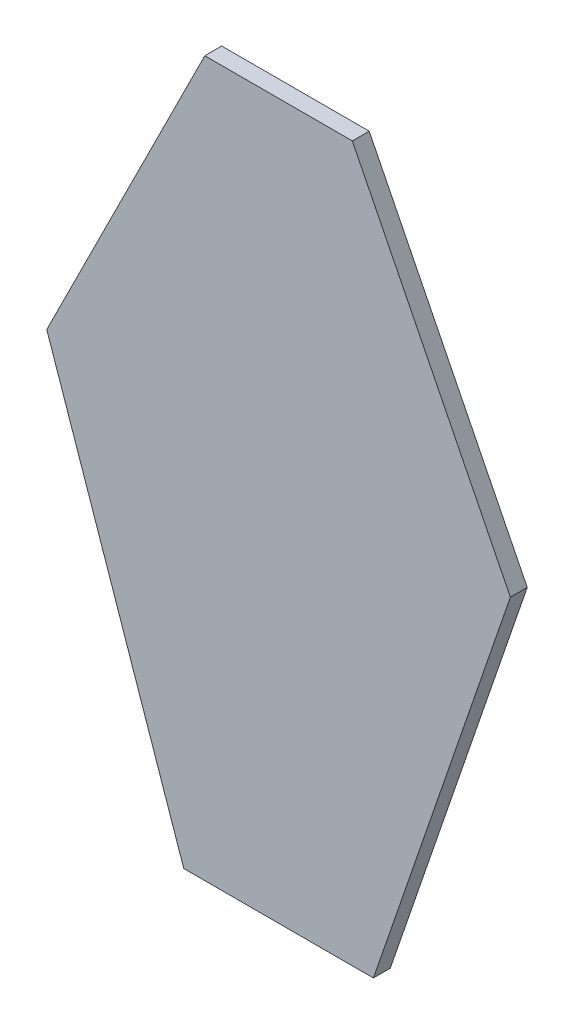
ISO-10303-21;
HEADER;
FILE_DESCRIPTION(('STEP AP214'),'2;1');
FILE_NAME('part.step','',(''),(''),'','','');
FILE_SCHEMA(('AUTOMOTIVE_DESIGN { 1 0 10303 214 1 1 1 1 }'));
ENDSEC;
DATA;
#1=APPLICATION_CONTEXT('core data for automotive mechanical design processes');
#2=APPLICATION_PROTOCOL_DEFINITION('international standard','automotive_design',2000,#1);
#3=PRODUCT_CONTEXT('',#1,'mechanical');
#4=PRODUCT('Part','Part','',(#3));
#5=PRODUCT_RELATED_PRODUCT_CATEGORY('part','',(#4));
#6=PRODUCT_DEFINITION_FORMATION('','',#4);
#7=PRODUCT_DEFINITION_CONTEXT('part definition',#1,'design');
#8=PRODUCT_DEFINITION('design','',#6,#7);
#9=PRODUCT_DEFINITION_SHAPE('','',#8);
#10=(LENGTH_UNIT() NAMED_UNIT(*) SI_UNIT(.MILLI.,.METRE.));
#11=(NAMED_UNIT(*) PLANE_ANGLE_UNIT() SI_UNIT($,.RADIAN.));
#12=(NAMED_UNIT(*) SI_UNIT($,.STERADIAN.) SOLID_ANGLE_UNIT());
#13=UNCERTAINTY_MEASURE_WITH_UNIT(LENGTH_MEASURE(1.E-05),#10,'distance_accuracy_value','');
#14=(GEOMETRIC_REPRESENTATION_CONTEXT(3) GLOBAL_UNCERTAINTY_ASSIGNED_CONTEXT((#13)) GLOBAL_UNIT_ASSIGNED_CONTEXT((#10,
#11,#12)) REPRESENTATION_CONTEXT('',''));
#15=CARTESIAN_POINT('',(0.,0.,0.));
#16=DIRECTION('',(0.,0.,1.));
#17=DIRECTION('',(1.,0.,0.));
#18=AXIS2_PLACEMENT_3D('',#15,#16,#17);
#19=CARTESIAN_POINT('',(-409.,-450.,16.));
#20=DIRECTION('',(0.,0.,1.));
#21=DIRECTION('',(1.,0.,0.));
#22=AXIS2_PLACEMENT_3D('',#19,#20,#21);
#23=PLANE('',#22);
#24=DIRECTION('',(-0.447213595499958,-0.894427190999916,0.));
#25=VECTOR('',#24,1.);
#26=CARTESIAN_POINT('',(-70.,228.,16.));
#27=LINE('',#26,#25);
#28=CARTESIAN_POINT('',(-70.,228.,16.));
#29=VERTEX_POINT('',#28);
#30=CARTESIAN_POINT('',(-220.,-71.9999999999998,16.));
#31=VERTEX_POINT('',#30);
#32=EDGE_CURVE('E126',#29,#31,#27,.T.);
#33=ORIENTED_EDGE('',*,*,#32,.T.);
#34=DIRECTION('',(0.325219597367365,-0.945638521575876,0.));
#35=VECTOR('',#34,1.);
#36=CARTESIAN_POINT('',(-220.,-71.9999999999998,16.));
#37=LINE('',#36,#35);
#38=CARTESIAN_POINT('',(-89.9999999999999,-450.,16.));
#39=VERTEX_POINT('',#38);
#40=EDGE_CURVE('E86',#31,#39,#37,.T.);
#41=ORIENTED_EDGE('',*,*,#40,.T.);
#42=DIRECTION('',(1.,0.,0.));
#43=VECTOR('',#42,1.);
#44=CARTESIAN_POINT('',(-89.9999999999999,-450.,16.));
#45=LINE('',#44,#43);
#46=CARTESIAN_POINT('',(90.0000000000001,-450.,16.));
#47=VERTEX_POINT('',#46);
#48=EDGE_CURVE('E98',#39,#47,#45,.T.);
#49=ORIENTED_EDGE('',*,*,#48,.T.);
#50=DIRECTION('',(0.325219597367365,0.945638521575876,0.));
#51=VECTOR('',#50,1.);
#52=CARTESIAN_POINT('',(220.,-71.9999999999996,16.));
#53=LINE('',#52,#51);
#54=CARTESIAN_POINT('',(220.,-71.9999999999996,16.));
#55=VERTEX_POINT('',#54);
#56=EDGE_CURVE('E93',#47,#55,#53,.T.);
#57=ORIENTED_EDGE('',*,*,#56,.T.);
#58=DIRECTION('',(-0.447213595499958,0.894427190999916,0.));
#59=VECTOR('',#58,1.);
#60=CARTESIAN_POINT('',(70.,228.,16.));
#61=LINE('',#60,#59);
#62=CARTESIAN_POINT('',(70.,228.,16.));
#63=VERTEX_POINT('',#62);
#64=EDGE_CURVE('E96',#55,#63,#61,.T.);
#65=ORIENTED_EDGE('',*,*,#64,.T.);
#66=DIRECTION('',(-1.,0.,0.));
#67=VECTOR('',#66,1.);
#68=CARTESIAN_POINT('',(-70.,228.,16.));
#69=LINE('',#68,#67);
#70=EDGE_CURVE('E49',#63,#29,#69,.T.);
#71=ORIENTED_EDGE('',*,*,#70,.T.);
#72=EDGE_LOOP('',(#33,#41,#49,#57,#65,#71));
#73=FACE_BOUND('',#72,.T.);
#74=ADVANCED_FACE('F32',(#73),#23,.T.);
#75=CARTESIAN_POINT('',(-409.,-450.,0.));
#76=DIRECTION('',(0.,0.,1.));
#77=DIRECTION('',(1.,0.,0.));
#78=AXIS2_PLACEMENT_3D('',#75,#76,#77);
#79=PLANE('',#78);
#80=DIRECTION('',(-0.447213595499958,-0.894427190999916,0.));
#81=VECTOR('',#80,1.);
#82=CARTESIAN_POINT('',(-70.,228.,0.));
#83=LINE('',#82,#81);
#84=CARTESIAN_POINT('',(-70.,228.,0.));
#85=VERTEX_POINT('',#84);
#86=CARTESIAN_POINT('',(-220.,-71.9999999999998,0.));
#87=VERTEX_POINT('',#86);
#88=EDGE_CURVE('E116',#85,#87,#83,.T.);
#89=ORIENTED_EDGE('',*,*,#88,.F.);
#90=DIRECTION('',(-1.,0.,0.));
#91=VECTOR('',#90,1.);
#92=CARTESIAN_POINT('',(-70.,228.,0.));
#93=LINE('',#92,#91);
#94=CARTESIAN_POINT('',(70.,228.,0.));
#95=VERTEX_POINT('',#94);
#96=EDGE_CURVE('E78',#95,#85,#93,.T.);
#97=ORIENTED_EDGE('',*,*,#96,.F.);
#98=DIRECTION('',(-0.447213595499958,0.894427190999916,0.));
#99=VECTOR('',#98,1.);
#100=CARTESIAN_POINT('',(70.,228.,0.));
#101=LINE('',#100,#99);
#102=CARTESIAN_POINT('',(220.,-71.9999999999996,0.));
#103=VERTEX_POINT('',#102);
#104=EDGE_CURVE('E72',#103,#95,#101,.T.);
#105=ORIENTED_EDGE('',*,*,#104,.F.);
#106=DIRECTION('',(0.325219597367365,0.945638521575876,0.));
#107=VECTOR('',#106,1.);
#108=CARTESIAN_POINT('',(220.,-71.9999999999996,0.));
#109=LINE('',#108,#107);
#110=CARTESIAN_POINT('',(90.0000000000001,-450.,0.));
#111=VERTEX_POINT('',#110);
#112=EDGE_CURVE('E106',#111,#103,#109,.T.);
#113=ORIENTED_EDGE('',*,*,#112,.F.);
#114=DIRECTION('',(1.,0.,0.));
#115=VECTOR('',#114,1.);
#116=CARTESIAN_POINT('',(-89.9999999999999,-450.,0.));
#117=LINE('',#116,#115);
#118=CARTESIAN_POINT('',(-89.9999999999999,-450.,0.));
#119=VERTEX_POINT('',#118);
#120=EDGE_CURVE('E121',#119,#111,#117,.T.);
#121=ORIENTED_EDGE('',*,*,#120,.F.);
#122=DIRECTION('',(0.325219597367365,-0.945638521575876,0.));
#123=VECTOR('',#122,1.);
#124=CARTESIAN_POINT('',(-220.,-71.9999999999998,0.));
#125=LINE('',#124,#123);
#126=EDGE_CURVE('E119',#87,#119,#125,.T.);
#127=ORIENTED_EDGE('',*,*,#126,.F.);
#128=EDGE_LOOP('',(#89,#97,#105,#113,#121,#127));
#129=FACE_BOUND('',#128,.T.);
#130=ADVANCED_FACE('F135',(#129),#79,.F.);
#131=CARTESIAN_POINT('',(-70.,228.,16.));
#132=DIRECTION('',(0.894427190999916,-0.447213595499958,0.));
#133=DIRECTION('',(0.447213595499958,0.894427190999916,0.));
#134=AXIS2_PLACEMENT_3D('',#131,#132,#133);
#135=PLANE('',#134);
#136=ORIENTED_EDGE('',*,*,#88,.T.);
#137=DIRECTION('',(0.,0.,-1.));
#138=VECTOR('',#137,1.);
#139=CARTESIAN_POINT('',(-220.,-71.9999999999998,16.));
#140=LINE('',#139,#138);
#141=EDGE_CURVE('E11',#31,#87,#140,.T.);
#142=ORIENTED_EDGE('',*,*,#141,.F.);
#143=ORIENTED_EDGE('',*,*,#32,.F.);
#144=DIRECTION('',(0.,0.,-1.));
#145=VECTOR('',#144,1.);
#146=CARTESIAN_POINT('',(-70.,228.,16.));
#147=LINE('',#146,#145);
#148=EDGE_CURVE('E112',#29,#85,#147,.T.);
#149=ORIENTED_EDGE('',*,*,#148,.T.);
#150=EDGE_LOOP('',(#136,#142,#143,#149));
#151=FACE_BOUND('',#150,.T.);
#152=ADVANCED_FACE('F34',(#151),#135,.F.);
#153=CARTESIAN_POINT('',(-220.,-71.9999999999998,16.));
#154=DIRECTION('',(0.945638521575876,0.325219597367365,0.));
#155=DIRECTION('',(-0.325219597367365,0.945638521575876,0.));
#156=AXIS2_PLACEMENT_3D('',#153,#154,#155);
#157=PLANE('',#156);
#158=ORIENTED_EDGE('',*,*,#126,.T.);
#159=DIRECTION('',(0.,0.,-1.));
#160=VECTOR('',#159,1.);
#161=CARTESIAN_POINT('',(-89.9999999999999,-450.,16.));
#162=LINE('',#161,#160);
#163=EDGE_CURVE('E41',#39,#119,#162,.T.);
#164=ORIENTED_EDGE('',*,*,#163,.F.);
#165=ORIENTED_EDGE('',*,*,#40,.F.);
#166=ORIENTED_EDGE('',*,*,#141,.T.);
#167=EDGE_LOOP('',(#158,#164,#165,#166));
#168=FACE_BOUND('',#167,.T.);
#169=ADVANCED_FACE('F155',(#168),#157,.F.);
#170=CARTESIAN_POINT('',(-89.9999999999999,-450.,16.));
#171=DIRECTION('',(0.,1.,0.));
#172=DIRECTION('',(0.,0.,1.));
#173=AXIS2_PLACEMENT_3D('',#170,#171,#172);
#174=PLANE('',#173);
#175=ORIENTED_EDGE('',*,*,#120,.T.);
#176=DIRECTION('',(0.,0.,-1.));
#177=VECTOR('',#176,1.);
#178=CARTESIAN_POINT('',(90.0000000000001,-450.,16.));
#179=LINE('',#178,#177);
#180=EDGE_CURVE('E107',#47,#111,#179,.T.);
#181=ORIENTED_EDGE('',*,*,#180,.F.);
#182=ORIENTED_EDGE('',*,*,#48,.F.);
#183=ORIENTED_EDGE('',*,*,#163,.T.);
#184=EDGE_LOOP('',(#175,#181,#182,#183));
#185=FACE_BOUND('',#184,.T.);
#186=ADVANCED_FACE('F132',(#185),#174,.F.);
#187=CARTESIAN_POINT('',(220.,-71.9999999999996,16.));
#188=DIRECTION('',(-0.945638521575876,0.325219597367365,0.));
#189=DIRECTION('',(-0.325219597367365,-0.945638521575877,0.));
#190=AXIS2_PLACEMENT_3D('',#187,#188,#189);
#191=PLANE('',#190);
#192=ORIENTED_EDGE('',*,*,#112,.T.);
#193=DIRECTION('',(0.,0.,-1.));
#194=VECTOR('',#193,1.);
#195=CARTESIAN_POINT('',(220.,-71.9999999999996,16.));
#196=LINE('',#195,#194);
#197=EDGE_CURVE('E103',#55,#103,#196,.T.);
#198=ORIENTED_EDGE('',*,*,#197,.F.);
#199=ORIENTED_EDGE('',*,*,#56,.F.);
#200=ORIENTED_EDGE('',*,*,#180,.T.);
#201=EDGE_LOOP('',(#192,#198,#199,#200));
#202=FACE_BOUND('',#201,.T.);
#203=ADVANCED_FACE('F104',(#202),#191,.F.);
#204=CARTESIAN_POINT('',(70.,228.,16.));
#205=DIRECTION('',(-0.894427190999916,-0.447213595499958,0.));
#206=DIRECTION('',(0.447213595499958,-0.894427190999916,0.));
#207=AXIS2_PLACEMENT_3D('',#204,#205,#206);
#208=PLANE('',#207);
#209=ORIENTED_EDGE('',*,*,#104,.T.);
#210=DIRECTION('',(0.,0.,-1.));
#211=VECTOR('',#210,1.);
#212=CARTESIAN_POINT('',(70.,228.,16.));
#213=LINE('',#212,#211);
#214=EDGE_CURVE('E108',#63,#95,#213,.T.);
#215=ORIENTED_EDGE('',*,*,#214,.F.);
#216=ORIENTED_EDGE('',*,*,#64,.F.);
#217=ORIENTED_EDGE('',*,*,#197,.T.);
#218=EDGE_LOOP('',(#209,#215,#216,#217));
#219=FACE_BOUND('',#218,.T.);
#220=ADVANCED_FACE('F110',(#219),#208,.F.);
#221=CARTESIAN_POINT('',(-70.,228.,16.));
#222=DIRECTION('',(0.,-1.,0.));
#223=DIRECTION('',(0.,0.,-1.));
#224=AXIS2_PLACEMENT_3D('',#221,#222,#223);
#225=PLANE('',#224);
#226=ORIENTED_EDGE('',*,*,#96,.T.);
#227=ORIENTED_EDGE('',*,*,#148,.F.);
#228=ORIENTED_EDGE('',*,*,#70,.F.);
#229=ORIENTED_EDGE('',*,*,#214,.T.);
#230=EDGE_LOOP('',(#226,#227,#228,#229));
#231=FACE_BOUND('',#230,.T.);
#232=ADVANCED_FACE('F139',(#231),#225,.F.);
#233=CLOSED_SHELL('',(#74,#130,#152,#169,#186,#203,#220,#232));
#234=MANIFOLD_SOLID_BREP('B2',#233);
#235=ADVANCED_BREP_SHAPE_REPRESENTATION('',(#18,#234),#14);
#236=SHAPE_DEFINITION_REPRESENTATION(#9,#235);
ENDSEC;
END-ISO-10303-21;
